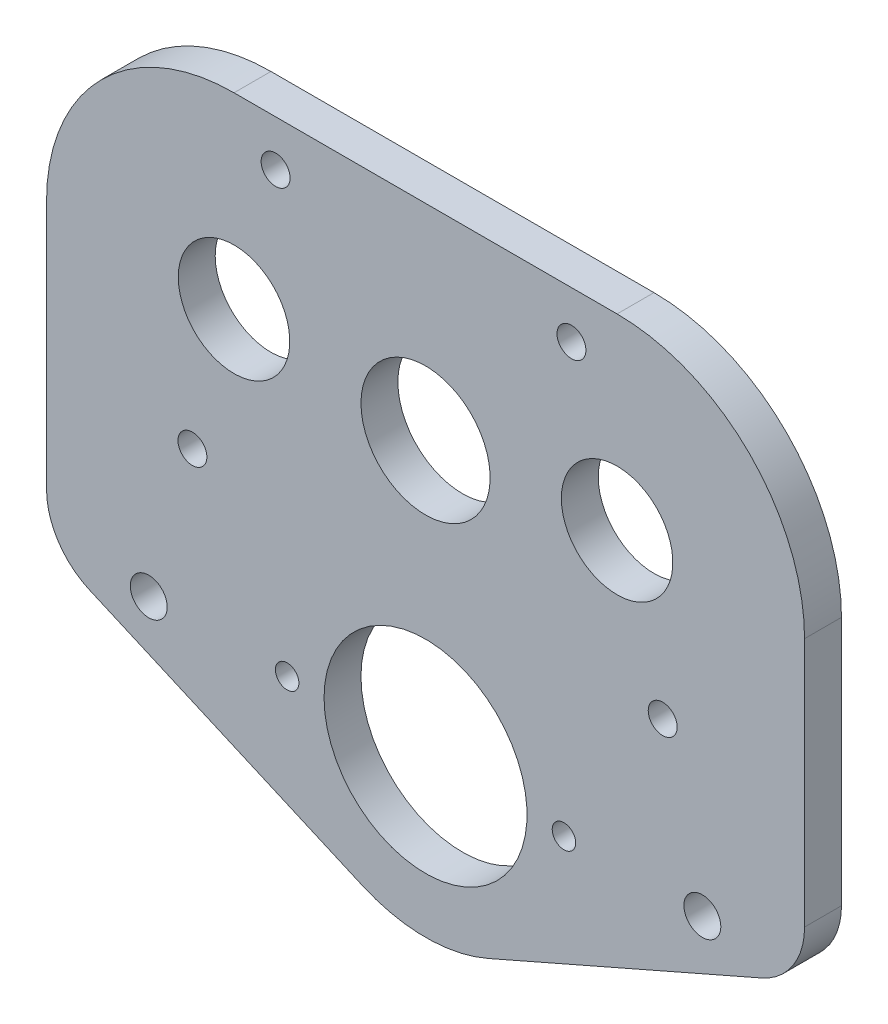
ISO-10303-21;
HEADER;
FILE_DESCRIPTION(('STEP AP214'),'2;1');
FILE_NAME('part.step','',(''),(''),'','','');
FILE_SCHEMA(('AUTOMOTIVE_DESIGN { 1 0 10303 214 1 1 1 1 }'));
ENDSEC;
DATA;
#1=APPLICATION_CONTEXT('core data for automotive mechanical design processes');
#2=APPLICATION_PROTOCOL_DEFINITION('international standard','automotive_design',2000,#1);
#3=PRODUCT_CONTEXT('',#1,'mechanical');
#4=PRODUCT('Part','Part','',(#3));
#5=PRODUCT_RELATED_PRODUCT_CATEGORY('part','',(#4));
#6=PRODUCT_DEFINITION_FORMATION('','',#4);
#7=PRODUCT_DEFINITION_CONTEXT('part definition',#1,'design');
#8=PRODUCT_DEFINITION('design','',#6,#7);
#9=PRODUCT_DEFINITION_SHAPE('','',#8);
#10=(LENGTH_UNIT() NAMED_UNIT(*) SI_UNIT(.MILLI.,.METRE.));
#11=(NAMED_UNIT(*) PLANE_ANGLE_UNIT() SI_UNIT($,.RADIAN.));
#12=(NAMED_UNIT(*) SI_UNIT($,.STERADIAN.) SOLID_ANGLE_UNIT());
#13=UNCERTAINTY_MEASURE_WITH_UNIT(LENGTH_MEASURE(1.E-05),#10,'distance_accuracy_value','');
#14=(GEOMETRIC_REPRESENTATION_CONTEXT(3) GLOBAL_UNCERTAINTY_ASSIGNED_CONTEXT((#13)) GLOBAL_UNIT_ASSIGNED_CONTEXT((#10,
#11,#12)) REPRESENTATION_CONTEXT('',''));
#15=CARTESIAN_POINT('',(0.,0.,0.));
#16=DIRECTION('',(0.,0.,1.));
#17=DIRECTION('',(1.,0.,0.));
#18=AXIS2_PLACEMENT_3D('',#15,#16,#17);
#19=CARTESIAN_POINT('',(-32.953753071217,50.1335462408504,-3.175));
#20=DIRECTION('',(0.,0.,1.));
#21=DIRECTION('',(1.,0.,0.));
#22=AXIS2_PLACEMENT_3D('',#19,#20,#21);
#23=PLANE('',#22);
#24=CARTESIAN_POINT('',(25.1047214140933,74.2903817547473,-3.175));
#25=DIRECTION('',(0.,0.,-1.));
#26=DIRECTION('',(-1.,0.,0.));
#27=AXIS2_PLACEMENT_3D('',#24,#25,#26);
#28=CIRCLE('',#27,2.4892);
#29=CARTESIAN_POINT('',(22.6155214140933,74.2903817547473,-3.175));
#30=VERTEX_POINT('',#29);
#31=EDGE_CURVE('E188',#30,#30,#28,.F.);
#32=ORIENTED_EDGE('',*,*,#31,.T.);
#33=EDGE_LOOP('',(#32));
#34=FACE_BOUND('',#33,.T.);
#35=CARTESIAN_POINT('',(-40.1097600149893,25.7624247110422,-3.175));
#36=DIRECTION('',(0.,0.,-1.));
#37=DIRECTION('',(-1.,0.,0.));
#38=AXIS2_PLACEMENT_3D('',#35,#36,#37);
#39=CIRCLE('',#38,2.4892);
#40=CARTESIAN_POINT('',(-42.5989600149893,25.7624247110422,-3.175));
#41=VERTEX_POINT('',#40);
#42=EDGE_CURVE('E191',#41,#41,#39,.F.);
#43=ORIENTED_EDGE('',*,*,#42,.T.);
#44=EDGE_LOOP('',(#43));
#45=FACE_BOUND('',#44,.T.);
#46=CARTESIAN_POINT('',(-32.953753071217,50.1335462408504,-3.175));
#47=DIRECTION('',(0.,0.,-1.));
#48=DIRECTION('',(-1.,0.,0.));
#49=AXIS2_PLACEMENT_3D('',#46,#47,#48);
#50=CIRCLE('',#49,9.5885);
#51=CARTESIAN_POINT('',(-42.542253071217,50.1335462408504,-3.175));
#52=VERTEX_POINT('',#51);
#53=EDGE_CURVE('E194',#52,#52,#50,.F.);
#54=ORIENTED_EDGE('',*,*,#53,.T.);
#55=EDGE_LOOP('',(#54));
#56=FACE_BOUND('',#55,.T.);
#57=CARTESIAN_POINT('',(0.,47.0662,-3.175));
#58=DIRECTION('',(0.,0.,-1.));
#59=DIRECTION('',(-1.,0.,0.));
#60=AXIS2_PLACEMENT_3D('',#57,#58,#59);
#61=CIRCLE('',#60,11.1125);
#62=CARTESIAN_POINT('',(-11.1125,47.0662,-3.175));
#63=VERTEX_POINT('',#62);
#64=EDGE_CURVE('E197',#63,#63,#61,.F.);
#65=ORIENTED_EDGE('',*,*,#64,.T.);
#66=EDGE_LOOP('',(#65));
#67=FACE_BOUND('',#66,.T.);
#68=CARTESIAN_POINT('',(-47.625,0.,-3.175));
#69=DIRECTION('',(0.,0.,-1.));
#70=DIRECTION('',(-1.,0.,0.));
#71=AXIS2_PLACEMENT_3D('',#68,#69,#70);
#72=CIRCLE('',#71,3.175);
#73=CARTESIAN_POINT('',(-50.8,0.,-3.175));
#74=VERTEX_POINT('',#73);
#75=EDGE_CURVE('E116',#74,#74,#72,.F.);
#76=ORIENTED_EDGE('',*,*,#75,.T.);
#77=EDGE_LOOP('',(#76));
#78=FACE_BOUND('',#77,.T.);
#79=CARTESIAN_POINT('',(47.625,0.,-3.175));
#80=DIRECTION('',(0.,0.,-1.));
#81=DIRECTION('',(-1.,0.,0.));
#82=AXIS2_PLACEMENT_3D('',#79,#80,#81);
#83=CIRCLE('',#82,3.175);
#84=CARTESIAN_POINT('',(44.45,0.,-3.175));
#85=VERTEX_POINT('',#84);
#86=EDGE_CURVE('E113',#85,#85,#83,.F.);
#87=ORIENTED_EDGE('',*,*,#86,.T.);
#88=EDGE_LOOP('',(#87));
#89=FACE_BOUND('',#88,.T.);
#90=DIRECTION('',(1.,0.,0.));
#91=VECTOR('',#90,1.);
#92=CARTESIAN_POINT('',(-32.953753071217,82.3915462408504,-3.175));
#93=LINE('',#92,#91);
#94=CARTESIAN_POINT('',(-32.953753071217,82.3915462408504,-3.175));
#95=VERTEX_POINT('',#94);
#96=CARTESIAN_POINT('',(32.953753071217,82.3915462408504,-3.175));
#97=VERTEX_POINT('',#96);
#98=EDGE_CURVE('E96',#95,#97,#93,.T.);
#99=ORIENTED_EDGE('',*,*,#98,.T.);
#100=CARTESIAN_POINT('',(32.953753071217,50.1335462408504,-3.175));
#101=DIRECTION('',(0.,0.,-1.));
#102=DIRECTION('',(-1.,0.,0.));
#103=AXIS2_PLACEMENT_3D('',#100,#101,#102);
#104=CIRCLE('',#103,32.258);
#105=CARTESIAN_POINT('',(65.211753071217,50.1335462408504,-3.175));
#106=VERTEX_POINT('',#105);
#107=EDGE_CURVE('E124',#106,#97,#104,.F.);
#108=ORIENTED_EDGE('',*,*,#107,.F.);
#109=DIRECTION('',(0.,1.,0.));
#110=VECTOR('',#109,1.);
#111=CARTESIAN_POINT('',(65.211753071217,50.1335462408504,-3.175));
#112=LINE('',#111,#110);
#113=CARTESIAN_POINT('',(65.211753071217,7.15989086379879,-3.175));
#114=VERTEX_POINT('',#113);
#115=EDGE_CURVE('E121',#106,#114,#112,.F.);
#116=ORIENTED_EDGE('',*,*,#115,.T.);
#117=CARTESIAN_POINT('',(52.8998993701809,7.15989086379879,-3.175));
#118=DIRECTION('',(0.,0.,-1.));
#119=DIRECTION('',(-1.,0.,0.));
#120=AXIS2_PLACEMENT_3D('',#117,#118,#119);
#121=CIRCLE('',#120,12.3118537010361);
#122=CARTESIAN_POINT('',(57.8417436831934,-4.11662971400636,-3.175));
#123=VERTEX_POINT('',#122);
#124=EDGE_CURVE('E129',#123,#114,#121,.F.);
#125=ORIENTED_EDGE('',*,*,#124,.F.);
#126=DIRECTION('',(-0.915907616483142,-0.401389135463542,0.));
#127=VECTOR('',#126,1.);
#128=CARTESIAN_POINT('',(57.8417436831934,-4.11662971400636,-3.175));
#129=LINE('',#128,#127);
#130=CARTESIAN_POINT('',(10.8324892933223,-24.7180567998388,-3.175));
#131=VERTEX_POINT('',#130);
#132=EDGE_CURVE('E126',#123,#131,#129,.T.);
#133=ORIENTED_EDGE('',*,*,#132,.T.);
#134=CARTESIAN_POINT('',(0.,0.,-3.175));
#135=DIRECTION('',(0.,0.,-1.));
#136=DIRECTION('',(-1.,0.,0.));
#137=AXIS2_PLACEMENT_3D('',#134,#135,#136);
#138=CIRCLE('',#137,26.9875);
#139=CARTESIAN_POINT('',(-10.8325973233683,-24.7180094562599,-3.175));
#140=VERTEX_POINT('',#139);
#141=EDGE_CURVE('E134',#140,#131,#138,.F.);
#142=ORIENTED_EDGE('',*,*,#141,.F.);
#143=DIRECTION('',(-0.915905862205091,0.401393138429581,0.));
#144=VECTOR('',#143,1.);
#145=CARTESIAN_POINT('',(-57.8417929671256,-4.11636320293274,-3.175));
#146=LINE('',#145,#144);
#147=CARTESIAN_POINT('',(-57.8417929671256,-4.11636320293274,-3.175));
#148=VERTEX_POINT('',#147);
#149=EDGE_CURVE('E131',#140,#148,#146,.T.);
#150=ORIENTED_EDGE('',*,*,#149,.T.);
#151=CARTESIAN_POINT('',(-52.8998993701808,7.1601357764577,-3.175));
#152=DIRECTION('',(0.,0.,-1.));
#153=DIRECTION('',(-1.,0.,0.));
#154=AXIS2_PLACEMENT_3D('',#151,#152,#153);
#155=CIRCLE('',#154,12.3118537010361);
#156=CARTESIAN_POINT('',(-65.211753071217,7.1601357764577,-3.175));
#157=VERTEX_POINT('',#156);
#158=EDGE_CURVE('E136',#157,#148,#155,.F.);
#159=ORIENTED_EDGE('',*,*,#158,.F.);
#160=DIRECTION('',(0.,1.,0.));
#161=VECTOR('',#160,1.);
#162=CARTESIAN_POINT('',(-65.211753071217,50.1335462408504,-3.175));
#163=LINE('',#162,#161);
#164=CARTESIAN_POINT('',(-65.211753071217,50.1335462408504,-3.175));
#165=VERTEX_POINT('',#164);
#166=EDGE_CURVE('E98',#157,#165,#163,.T.);
#167=ORIENTED_EDGE('',*,*,#166,.T.);
#168=CARTESIAN_POINT('',(-32.953753071217,50.1335462408504,-3.175));
#169=DIRECTION('',(0.,0.,-1.));
#170=DIRECTION('',(-1.,0.,0.));
#171=AXIS2_PLACEMENT_3D('',#168,#169,#170);
#172=CIRCLE('',#171,32.258);
#173=EDGE_CURVE('E92',#95,#165,#172,.F.);
#174=ORIENTED_EDGE('',*,*,#173,.F.);
#175=EDGE_LOOP('',(#99,#108,#116,#125,#133,#142,#150,#159,#167,#174));
#176=FACE_BOUND('',#175,.T.);
#177=CARTESIAN_POINT('',(0.,0.,-3.175));
#178=DIRECTION('',(0.,0.,-1.));
#179=DIRECTION('',(-1.,0.,0.));
#180=AXIS2_PLACEMENT_3D('',#177,#178,#179);
#181=CIRCLE('',#180,17.4625);
#182=CARTESIAN_POINT('',(-17.4625,0.,-3.175));
#183=VERTEX_POINT('',#182);
#184=EDGE_CURVE('E102',#183,#183,#181,.F.);
#185=ORIENTED_EDGE('',*,*,#184,.T.);
#186=EDGE_LOOP('',(#185));
#187=FACE_BOUND('',#186,.T.);
#188=CARTESIAN_POINT('',(-23.8125,0.,-3.175));
#189=DIRECTION('',(0.,0.,-1.));
#190=DIRECTION('',(-1.,0.,0.));
#191=AXIS2_PLACEMENT_3D('',#188,#189,#190);
#192=CIRCLE('',#191,2.0193);
#193=CARTESIAN_POINT('',(-25.8318,0.,-3.175));
#194=VERTEX_POINT('',#193);
#195=EDGE_CURVE('E212',#194,#194,#192,.F.);
#196=ORIENTED_EDGE('',*,*,#195,.T.);
#197=EDGE_LOOP('',(#196));
#198=FACE_BOUND('',#197,.T.);
#199=CARTESIAN_POINT('',(23.8125,0.,-3.175));
#200=DIRECTION('',(0.,0.,-1.));
#201=DIRECTION('',(-1.,0.,0.));
#202=AXIS2_PLACEMENT_3D('',#199,#200,#201);
#203=CIRCLE('',#202,2.0193);
#204=CARTESIAN_POINT('',(21.7932,0.,-3.175));
#205=VERTEX_POINT('',#204);
#206=EDGE_CURVE('E215',#205,#205,#203,.F.);
#207=ORIENTED_EDGE('',*,*,#206,.T.);
#208=EDGE_LOOP('',(#207));
#209=FACE_BOUND('',#208,.T.);
#210=CARTESIAN_POINT('',(32.953753071217,50.1335462408504,-3.175));
#211=DIRECTION('',(0.,0.,-1.));
#212=DIRECTION('',(-1.,0.,0.));
#213=AXIS2_PLACEMENT_3D('',#210,#211,#212);
#214=CIRCLE('',#213,9.58850000000001);
#215=CARTESIAN_POINT('',(23.365253071217,50.1335462408504,-3.175));
#216=VERTEX_POINT('',#215);
#217=EDGE_CURVE('E218',#216,#216,#214,.F.);
#218=ORIENTED_EDGE('',*,*,#217,.T.);
#219=EDGE_LOOP('',(#218));
#220=FACE_BOUND('',#219,.T.);
#221=CARTESIAN_POINT('',(-25.7977461274447,74.5046677706586,-3.175));
#222=DIRECTION('',(0.,0.,-1.));
#223=DIRECTION('',(-1.,0.,0.));
#224=AXIS2_PLACEMENT_3D('',#221,#222,#223);
#225=CIRCLE('',#224,2.48919999999999);
#226=CARTESIAN_POINT('',(-28.2869461274446,74.5046677706586,-3.175));
#227=VERTEX_POINT('',#226);
#228=EDGE_CURVE('E220',#227,#227,#225,.F.);
#229=ORIENTED_EDGE('',*,*,#228,.T.);
#230=EDGE_LOOP('',(#229));
#231=FACE_BOUND('',#230,.T.);
#232=CARTESIAN_POINT('',(40.8027847283406,25.9767107269535,-3.175));
#233=DIRECTION('',(0.,0.,-1.));
#234=DIRECTION('',(-1.,0.,0.));
#235=AXIS2_PLACEMENT_3D('',#232,#233,#234);
#236=CIRCLE('',#235,2.48919999999999);
#237=CARTESIAN_POINT('',(38.3135847283406,25.9767107269535,-3.175));
#238=VERTEX_POINT('',#237);
#239=EDGE_CURVE('E20',#238,#238,#236,.F.);
#240=ORIENTED_EDGE('',*,*,#239,.T.);
#241=EDGE_LOOP('',(#240));
#242=FACE_BOUND('',#241,.T.);
#243=ADVANCED_FACE('F17',(#34,#45,#56,#67,#78,#89,#176,#187,#198,#209,#220,#231,#242),#23,.F.);
#244=CARTESIAN_POINT('',(40.8027847283406,25.9767107269535,3.175));
#245=DIRECTION('',(0.,0.,-1.));
#246=DIRECTION('',(-1.,0.,0.));
#247=AXIS2_PLACEMENT_3D('',#244,#245,#246);
#248=CYLINDRICAL_SURFACE('',#247,2.48919999999999);
#249=CARTESIAN_POINT('',(40.8027847283406,25.9767107269535,3.175));
#250=DIRECTION('',(0.,0.,-1.));
#251=DIRECTION('',(-1.,0.,0.));
#252=AXIS2_PLACEMENT_3D('',#249,#250,#251);
#253=CIRCLE('',#252,2.48919999999999);
#254=CARTESIAN_POINT('',(38.3135847283406,25.9767107269535,3.175));
#255=VERTEX_POINT('',#254);
#256=EDGE_CURVE('E185',#255,#255,#253,.T.);
#257=ORIENTED_EDGE('',*,*,#256,.F.);
#258=EDGE_LOOP('',(#257));
#259=FACE_BOUND('',#258,.T.);
#260=ORIENTED_EDGE('',*,*,#239,.F.);
#261=EDGE_LOOP('',(#260));
#262=FACE_BOUND('',#261,.T.);
#263=ADVANCED_FACE('F228',(#259,#262),#248,.F.);
#264=CARTESIAN_POINT('',(-25.7977461274447,74.5046677706586,3.175));
#265=DIRECTION('',(0.,0.,-1.));
#266=DIRECTION('',(-1.,0.,0.));
#267=AXIS2_PLACEMENT_3D('',#264,#265,#266);
#268=CYLINDRICAL_SURFACE('',#267,2.48919999999999);
#269=CARTESIAN_POINT('',(-25.7977461274447,74.5046677706586,3.175));
#270=DIRECTION('',(0.,0.,-1.));
#271=DIRECTION('',(-1.,0.,0.));
#272=AXIS2_PLACEMENT_3D('',#269,#270,#271);
#273=CIRCLE('',#272,2.48919999999999);
#274=CARTESIAN_POINT('',(-28.2869461274446,74.5046677706586,3.175));
#275=VERTEX_POINT('',#274);
#276=EDGE_CURVE('E182',#275,#275,#273,.T.);
#277=ORIENTED_EDGE('',*,*,#276,.F.);
#278=EDGE_LOOP('',(#277));
#279=FACE_BOUND('',#278,.T.);
#280=ORIENTED_EDGE('',*,*,#228,.F.);
#281=EDGE_LOOP('',(#280));
#282=FACE_BOUND('',#281,.T.);
#283=ADVANCED_FACE('F230',(#279,#282),#268,.F.);
#284=CARTESIAN_POINT('',(32.953753071217,50.1335462408504,3.175));
#285=DIRECTION('',(0.,0.,-1.));
#286=DIRECTION('',(-1.,0.,0.));
#287=AXIS2_PLACEMENT_3D('',#284,#285,#286);
#288=CYLINDRICAL_SURFACE('',#287,9.58850000000001);
#289=CARTESIAN_POINT('',(32.953753071217,50.1335462408504,3.175));
#290=DIRECTION('',(0.,0.,-1.));
#291=DIRECTION('',(-1.,0.,0.));
#292=AXIS2_PLACEMENT_3D('',#289,#290,#291);
#293=CIRCLE('',#292,9.58850000000001);
#294=CARTESIAN_POINT('',(23.365253071217,50.1335462408504,3.175));
#295=VERTEX_POINT('',#294);
#296=EDGE_CURVE('E179',#295,#295,#293,.T.);
#297=ORIENTED_EDGE('',*,*,#296,.F.);
#298=EDGE_LOOP('',(#297));
#299=FACE_BOUND('',#298,.T.);
#300=ORIENTED_EDGE('',*,*,#217,.F.);
#301=EDGE_LOOP('',(#300));
#302=FACE_BOUND('',#301,.T.);
#303=ADVANCED_FACE('F237',(#299,#302),#288,.F.);
#304=CARTESIAN_POINT('',(23.8125,0.,3.175));
#305=DIRECTION('',(0.,0.,-1.));
#306=DIRECTION('',(-1.,0.,0.));
#307=AXIS2_PLACEMENT_3D('',#304,#305,#306);
#308=CYLINDRICAL_SURFACE('',#307,2.0193);
#309=CARTESIAN_POINT('',(23.8125,0.,3.175));
#310=DIRECTION('',(0.,0.,-1.));
#311=DIRECTION('',(-1.,0.,0.));
#312=AXIS2_PLACEMENT_3D('',#309,#310,#311);
#313=CIRCLE('',#312,2.0193);
#314=CARTESIAN_POINT('',(21.7932,0.,3.175));
#315=VERTEX_POINT('',#314);
#316=EDGE_CURVE('E176',#315,#315,#313,.T.);
#317=ORIENTED_EDGE('',*,*,#316,.F.);
#318=EDGE_LOOP('',(#317));
#319=FACE_BOUND('',#318,.T.);
#320=ORIENTED_EDGE('',*,*,#206,.F.);
#321=EDGE_LOOP('',(#320));
#322=FACE_BOUND('',#321,.T.);
#323=ADVANCED_FACE('F316',(#319,#322),#308,.F.);
#324=CARTESIAN_POINT('',(-23.8125,0.,3.175));
#325=DIRECTION('',(0.,0.,-1.));
#326=DIRECTION('',(-1.,0.,0.));
#327=AXIS2_PLACEMENT_3D('',#324,#325,#326);
#328=CYLINDRICAL_SURFACE('',#327,2.0193);
#329=CARTESIAN_POINT('',(-23.8125,0.,3.175));
#330=DIRECTION('',(0.,0.,-1.));
#331=DIRECTION('',(-1.,0.,0.));
#332=AXIS2_PLACEMENT_3D('',#329,#330,#331);
#333=CIRCLE('',#332,2.0193);
#334=CARTESIAN_POINT('',(-25.8318,0.,3.175));
#335=VERTEX_POINT('',#334);
#336=EDGE_CURVE('E173',#335,#335,#333,.T.);
#337=ORIENTED_EDGE('',*,*,#336,.F.);
#338=EDGE_LOOP('',(#337));
#339=FACE_BOUND('',#338,.T.);
#340=ORIENTED_EDGE('',*,*,#195,.F.);
#341=EDGE_LOOP('',(#340));
#342=FACE_BOUND('',#341,.T.);
#343=ADVANCED_FACE('F312',(#339,#342),#328,.F.);
#344=CARTESIAN_POINT('',(0.,0.,3.175));
#345=DIRECTION('',(0.,0.,-1.));
#346=DIRECTION('',(-1.,0.,0.));
#347=AXIS2_PLACEMENT_3D('',#344,#345,#346);
#348=CYLINDRICAL_SURFACE('',#347,17.4625);
#349=CARTESIAN_POINT('',(0.,0.,3.175));
#350=DIRECTION('',(0.,0.,-1.));
#351=DIRECTION('',(-1.,0.,0.));
#352=AXIS2_PLACEMENT_3D('',#349,#350,#351);
#353=CIRCLE('',#352,17.4625);
#354=CARTESIAN_POINT('',(-17.4625,0.,3.175));
#355=VERTEX_POINT('',#354);
#356=EDGE_CURVE('E170',#355,#355,#353,.T.);
#357=ORIENTED_EDGE('',*,*,#356,.F.);
#358=EDGE_LOOP('',(#357));
#359=FACE_BOUND('',#358,.T.);
#360=ORIENTED_EDGE('',*,*,#184,.F.);
#361=EDGE_LOOP('',(#360));
#362=FACE_BOUND('',#361,.T.);
#363=ADVANCED_FACE('F309',(#359,#362),#348,.F.);
#364=CARTESIAN_POINT('',(-32.953753071217,50.1335462408504,3.175));
#365=DIRECTION('',(0.,0.,-1.));
#366=DIRECTION('',(-1.,0.,0.));
#367=AXIS2_PLACEMENT_3D('',#364,#365,#366);
#368=CYLINDRICAL_SURFACE('',#367,32.258);
#369=CARTESIAN_POINT('',(-32.953753071217,50.1335462408504,3.175));
#370=DIRECTION('',(0.,0.,-1.));
#371=DIRECTION('',(-1.,0.,0.));
#372=AXIS2_PLACEMENT_3D('',#369,#370,#371);
#373=CIRCLE('',#372,32.258);
#374=CARTESIAN_POINT('',(-32.953753071217,82.3915462408504,3.175));
#375=VERTEX_POINT('',#374);
#376=CARTESIAN_POINT('',(-65.211753071217,50.1335462408504,3.175));
#377=VERTEX_POINT('',#376);
#378=EDGE_CURVE('E108',#375,#377,#373,.F.);
#379=ORIENTED_EDGE('',*,*,#378,.F.);
#380=DIRECTION('',(0.,0.,-1.));
#381=VECTOR('',#380,1.);
#382=CARTESIAN_POINT('',(-32.953753071217,82.3915462408504,3.175));
#383=LINE('',#382,#381);
#384=EDGE_CURVE('E105',#375,#95,#383,.T.);
#385=ORIENTED_EDGE('',*,*,#384,.T.);
#386=ORIENTED_EDGE('',*,*,#173,.T.);
#387=DIRECTION('',(0.,0.,-1.));
#388=VECTOR('',#387,1.);
#389=CARTESIAN_POINT('',(-65.211753071217,50.1335462408504,3.175));
#390=LINE('',#389,#388);
#391=EDGE_CURVE('E101',#165,#377,#390,.F.);
#392=ORIENTED_EDGE('',*,*,#391,.T.);
#393=EDGE_LOOP('',(#379,#385,#386,#392));
#394=FACE_BOUND('',#393,.T.);
#395=ADVANCED_FACE('F106',(#394),#368,.T.);
#396=CARTESIAN_POINT('',(-65.211753071217,50.1335462408504,3.175));
#397=DIRECTION('',(1.,0.,0.));
#398=DIRECTION('',(0.,0.,-1.));
#399=AXIS2_PLACEMENT_3D('',#396,#397,#398);
#400=PLANE('',#399);
#401=DIRECTION('',(0.,0.,-1.));
#402=VECTOR('',#401,1.);
#403=CARTESIAN_POINT('',(-65.211753071217,7.1601357764577,3.175));
#404=LINE('',#403,#402);
#405=CARTESIAN_POINT('',(-65.211753071217,7.1601357764577,3.175));
#406=VERTEX_POINT('',#405);
#407=EDGE_CURVE('E208',#406,#157,#404,.T.);
#408=ORIENTED_EDGE('',*,*,#407,.F.);
#409=DIRECTION('',(0.,1.,0.));
#410=VECTOR('',#409,1.);
#411=CARTESIAN_POINT('',(-65.211753071217,50.1335462408504,3.175));
#412=LINE('',#411,#410);
#413=EDGE_CURVE('E168',#377,#406,#412,.F.);
#414=ORIENTED_EDGE('',*,*,#413,.F.);
#415=ORIENTED_EDGE('',*,*,#391,.F.);
#416=ORIENTED_EDGE('',*,*,#166,.F.);
#417=EDGE_LOOP('',(#408,#414,#415,#416));
#418=FACE_BOUND('',#417,.T.);
#419=ADVANCED_FACE('F302',(#418),#400,.F.);
#420=CARTESIAN_POINT('',(-52.8998993701808,7.1601357764577,3.175));
#421=DIRECTION('',(0.,0.,-1.));
#422=DIRECTION('',(-1.,0.,0.));
#423=AXIS2_PLACEMENT_3D('',#420,#421,#422);
#424=CYLINDRICAL_SURFACE('',#423,12.3118537010361);
#425=CARTESIAN_POINT('',(-52.8998993701808,7.1601357764577,3.175));
#426=DIRECTION('',(0.,0.,-1.));
#427=DIRECTION('',(-1.,0.,0.));
#428=AXIS2_PLACEMENT_3D('',#425,#426,#427);
#429=CIRCLE('',#428,12.3118537010361);
#430=CARTESIAN_POINT('',(-57.8417929671256,-4.11636320293273,3.175));
#431=VERTEX_POINT('',#430);
#432=EDGE_CURVE('E165',#406,#431,#429,.F.);
#433=ORIENTED_EDGE('',*,*,#432,.F.);
#434=ORIENTED_EDGE('',*,*,#407,.T.);
#435=ORIENTED_EDGE('',*,*,#158,.T.);
#436=DIRECTION('',(0.,0.,1.));
#437=VECTOR('',#436,1.);
#438=CARTESIAN_POINT('',(-57.8417929671256,-4.11636320293274,3.175));
#439=LINE('',#438,#437);
#440=EDGE_CURVE('E135',#148,#431,#439,.T.);
#441=ORIENTED_EDGE('',*,*,#440,.T.);
#442=EDGE_LOOP('',(#433,#434,#435,#441));
#443=FACE_BOUND('',#442,.T.);
#444=ADVANCED_FACE('F298',(#443),#424,.T.);
#445=CARTESIAN_POINT('',(-57.8417929671256,-4.11636320293274,3.175));
#446=DIRECTION('',(0.401393138429581,0.915905862205091,0.));
#447=DIRECTION('',(-0.915905862205091,0.401393138429581,0.));
#448=AXIS2_PLACEMENT_3D('',#445,#446,#447);
#449=PLANE('',#448);
#450=DIRECTION('',(0.,0.,-1.));
#451=VECTOR('',#450,1.);
#452=CARTESIAN_POINT('',(-10.8325973233683,-24.7180094562599,3.175));
#453=LINE('',#452,#451);
#454=CARTESIAN_POINT('',(-10.8325973233683,-24.7180094562599,3.175));
#455=VERTEX_POINT('',#454);
#456=EDGE_CURVE('E207',#455,#140,#453,.T.);
#457=ORIENTED_EDGE('',*,*,#456,.F.);
#458=DIRECTION('',(0.915905862205091,-0.401393138429581,0.));
#459=VECTOR('',#458,1.);
#460=CARTESIAN_POINT('',(-57.8417929671256,-4.11636320293274,3.175));
#461=LINE('',#460,#459);
#462=EDGE_CURVE('E164',#431,#455,#461,.T.);
#463=ORIENTED_EDGE('',*,*,#462,.F.);
#464=ORIENTED_EDGE('',*,*,#440,.F.);
#465=ORIENTED_EDGE('',*,*,#149,.F.);
#466=EDGE_LOOP('',(#457,#463,#464,#465));
#467=FACE_BOUND('',#466,.T.);
#468=ADVANCED_FACE('F294',(#467),#449,.F.);
#469=CARTESIAN_POINT('',(0.,0.,3.175));
#470=DIRECTION('',(0.,0.,-1.));
#471=DIRECTION('',(-1.,0.,0.));
#472=AXIS2_PLACEMENT_3D('',#469,#470,#471);
#473=CYLINDRICAL_SURFACE('',#472,26.9875);
#474=CARTESIAN_POINT('',(0.,0.,3.175));
#475=DIRECTION('',(0.,0.,-1.));
#476=DIRECTION('',(-1.,0.,0.));
#477=AXIS2_PLACEMENT_3D('',#474,#475,#476);
#478=CIRCLE('',#477,26.9875);
#479=CARTESIAN_POINT('',(10.8324892933223,-24.7180567998388,3.175));
#480=VERTEX_POINT('',#479);
#481=EDGE_CURVE('E161',#455,#480,#478,.F.);
#482=ORIENTED_EDGE('',*,*,#481,.F.);
#483=ORIENTED_EDGE('',*,*,#456,.T.);
#484=ORIENTED_EDGE('',*,*,#141,.T.);
#485=DIRECTION('',(0.,0.,1.));
#486=VECTOR('',#485,1.);
#487=CARTESIAN_POINT('',(10.8324892933223,-24.7180567998388,3.175));
#488=LINE('',#487,#486);
#489=EDGE_CURVE('E130',#131,#480,#488,.T.);
#490=ORIENTED_EDGE('',*,*,#489,.T.);
#491=EDGE_LOOP('',(#482,#483,#484,#490));
#492=FACE_BOUND('',#491,.T.);
#493=ADVANCED_FACE('F290',(#492),#473,.T.);
#494=CARTESIAN_POINT('',(57.8417436831934,-4.11662971400636,3.175));
#495=DIRECTION('',(-0.401389135463542,0.915907616483142,0.));
#496=DIRECTION('',(-0.915907616483142,-0.401389135463542,0.));
#497=AXIS2_PLACEMENT_3D('',#494,#495,#496);
#498=PLANE('',#497);
#499=DIRECTION('',(0.,0.,-1.));
#500=VECTOR('',#499,1.);
#501=CARTESIAN_POINT('',(57.8417436831934,-4.11662971400635,3.175));
#502=LINE('',#501,#500);
#503=CARTESIAN_POINT('',(57.8417436831934,-4.11662971400636,3.175));
#504=VERTEX_POINT('',#503);
#505=EDGE_CURVE('E205',#504,#123,#502,.T.);
#506=ORIENTED_EDGE('',*,*,#505,.F.);
#507=DIRECTION('',(0.915907616483142,0.401389135463541,0.));
#508=VECTOR('',#507,1.);
#509=CARTESIAN_POINT('',(10.8324892933223,-24.7180567998388,3.175));
#510=LINE('',#509,#508);
#511=EDGE_CURVE('E160',#480,#504,#510,.T.);
#512=ORIENTED_EDGE('',*,*,#511,.F.);
#513=ORIENTED_EDGE('',*,*,#489,.F.);
#514=ORIENTED_EDGE('',*,*,#132,.F.);
#515=EDGE_LOOP('',(#506,#512,#513,#514));
#516=FACE_BOUND('',#515,.T.);
#517=ADVANCED_FACE('F286',(#516),#498,.F.);
#518=CARTESIAN_POINT('',(52.8998993701809,7.15989086379879,3.175));
#519=DIRECTION('',(0.,0.,-1.));
#520=DIRECTION('',(-1.,0.,0.));
#521=AXIS2_PLACEMENT_3D('',#518,#519,#520);
#522=CYLINDRICAL_SURFACE('',#521,12.3118537010361);
#523=CARTESIAN_POINT('',(52.8998993701809,7.15989086379879,3.175));
#524=DIRECTION('',(0.,0.,-1.));
#525=DIRECTION('',(-1.,0.,0.));
#526=AXIS2_PLACEMENT_3D('',#523,#524,#525);
#527=CIRCLE('',#526,12.3118537010361);
#528=CARTESIAN_POINT('',(65.211753071217,7.15989086379879,3.175));
#529=VERTEX_POINT('',#528);
#530=EDGE_CURVE('E157',#504,#529,#527,.F.);
#531=ORIENTED_EDGE('',*,*,#530,.F.);
#532=ORIENTED_EDGE('',*,*,#505,.T.);
#533=ORIENTED_EDGE('',*,*,#124,.T.);
#534=DIRECTION('',(0.,0.,1.));
#535=VECTOR('',#534,1.);
#536=CARTESIAN_POINT('',(65.211753071217,7.15989086379879,3.175));
#537=LINE('',#536,#535);
#538=EDGE_CURVE('E125',#114,#529,#537,.T.);
#539=ORIENTED_EDGE('',*,*,#538,.T.);
#540=EDGE_LOOP('',(#531,#532,#533,#539));
#541=FACE_BOUND('',#540,.T.);
#542=ADVANCED_FACE('F282',(#541),#522,.T.);
#543=CARTESIAN_POINT('',(65.211753071217,50.1335462408504,3.175));
#544=DIRECTION('',(-1.,0.,0.));
#545=DIRECTION('',(0.,0.,1.));
#546=AXIS2_PLACEMENT_3D('',#543,#544,#545);
#547=PLANE('',#546);
#548=DIRECTION('',(0.,0.,-1.));
#549=VECTOR('',#548,1.);
#550=CARTESIAN_POINT('',(65.211753071217,50.1335462408504,3.175));
#551=LINE('',#550,#549);
#552=CARTESIAN_POINT('',(65.211753071217,50.1335462408504,3.175));
#553=VERTEX_POINT('',#552);
#554=EDGE_CURVE('E203',#553,#106,#551,.T.);
#555=ORIENTED_EDGE('',*,*,#554,.F.);
#556=DIRECTION('',(0.,1.,0.));
#557=VECTOR('',#556,1.);
#558=CARTESIAN_POINT('',(65.211753071217,50.1335462408504,3.175));
#559=LINE('',#558,#557);
#560=EDGE_CURVE('E156',#529,#553,#559,.T.);
#561=ORIENTED_EDGE('',*,*,#560,.F.);
#562=ORIENTED_EDGE('',*,*,#538,.F.);
#563=ORIENTED_EDGE('',*,*,#115,.F.);
#564=EDGE_LOOP('',(#555,#561,#562,#563));
#565=FACE_BOUND('',#564,.T.);
#566=ADVANCED_FACE('F279',(#565),#547,.F.);
#567=CARTESIAN_POINT('',(32.953753071217,50.1335462408504,3.175));
#568=DIRECTION('',(0.,0.,-1.));
#569=DIRECTION('',(-1.,0.,0.));
#570=AXIS2_PLACEMENT_3D('',#567,#568,#569);
#571=CYLINDRICAL_SURFACE('',#570,32.258);
#572=CARTESIAN_POINT('',(32.953753071217,50.1335462408504,3.175));
#573=DIRECTION('',(0.,0.,-1.));
#574=DIRECTION('',(-1.,0.,0.));
#575=AXIS2_PLACEMENT_3D('',#572,#573,#574);
#576=CIRCLE('',#575,32.258);
#577=CARTESIAN_POINT('',(32.953753071217,82.3915462408504,3.175));
#578=VERTEX_POINT('',#577);
#579=EDGE_CURVE('E153',#553,#578,#576,.F.);
#580=ORIENTED_EDGE('',*,*,#579,.F.);
#581=ORIENTED_EDGE('',*,*,#554,.T.);
#582=ORIENTED_EDGE('',*,*,#107,.T.);
#583=DIRECTION('',(0.,0.,-1.));
#584=VECTOR('',#583,1.);
#585=CARTESIAN_POINT('',(32.953753071217,82.3915462408504,3.175));
#586=LINE('',#585,#584);
#587=EDGE_CURVE('E35',#97,#578,#586,.F.);
#588=ORIENTED_EDGE('',*,*,#587,.T.);
#589=EDGE_LOOP('',(#580,#581,#582,#588));
#590=FACE_BOUND('',#589,.T.);
#591=ADVANCED_FACE('F276',(#590),#571,.T.);
#592=CARTESIAN_POINT('',(-32.953753071217,82.3915462408504,3.175));
#593=DIRECTION('',(0.,-1.,0.));
#594=DIRECTION('',(0.,0.,-1.));
#595=AXIS2_PLACEMENT_3D('',#592,#593,#594);
#596=PLANE('',#595);
#597=ORIENTED_EDGE('',*,*,#384,.F.);
#598=DIRECTION('',(1.,0.,0.));
#599=VECTOR('',#598,1.);
#600=CARTESIAN_POINT('',(-32.953753071217,82.3915462408504,3.175));
#601=LINE('',#600,#599);
#602=EDGE_CURVE('E152',#578,#375,#601,.F.);
#603=ORIENTED_EDGE('',*,*,#602,.F.);
#604=ORIENTED_EDGE('',*,*,#587,.F.);
#605=ORIENTED_EDGE('',*,*,#98,.F.);
#606=EDGE_LOOP('',(#597,#603,#604,#605));
#607=FACE_BOUND('',#606,.T.);
#608=ADVANCED_FACE('F112',(#607),#596,.F.);
#609=CARTESIAN_POINT('',(47.625,0.,3.175));
#610=DIRECTION('',(0.,0.,-1.));
#611=DIRECTION('',(-1.,0.,0.));
#612=AXIS2_PLACEMENT_3D('',#609,#610,#611);
#613=CYLINDRICAL_SURFACE('',#612,3.175);
#614=CARTESIAN_POINT('',(47.625,0.,3.175));
#615=DIRECTION('',(0.,0.,-1.));
#616=DIRECTION('',(-1.,0.,0.));
#617=AXIS2_PLACEMENT_3D('',#614,#615,#616);
#618=CIRCLE('',#617,3.175);
#619=CARTESIAN_POINT('',(44.45,0.,3.175));
#620=VERTEX_POINT('',#619);
#621=EDGE_CURVE('E149',#620,#620,#618,.T.);
#622=ORIENTED_EDGE('',*,*,#621,.F.);
#623=EDGE_LOOP('',(#622));
#624=FACE_BOUND('',#623,.T.);
#625=ORIENTED_EDGE('',*,*,#86,.F.);
#626=EDGE_LOOP('',(#625));
#627=FACE_BOUND('',#626,.T.);
#628=ADVANCED_FACE('F269',(#624,#627),#613,.F.);
#629=CARTESIAN_POINT('',(-47.625,0.,3.175));
#630=DIRECTION('',(0.,0.,-1.));
#631=DIRECTION('',(-1.,0.,0.));
#632=AXIS2_PLACEMENT_3D('',#629,#630,#631);
#633=CYLINDRICAL_SURFACE('',#632,3.175);
#634=CARTESIAN_POINT('',(-47.625,0.,3.175));
#635=DIRECTION('',(0.,0.,-1.));
#636=DIRECTION('',(-1.,0.,0.));
#637=AXIS2_PLACEMENT_3D('',#634,#635,#636);
#638=CIRCLE('',#637,3.175);
#639=CARTESIAN_POINT('',(-50.8,0.,3.175));
#640=VERTEX_POINT('',#639);
#641=EDGE_CURVE('E146',#640,#640,#638,.T.);
#642=ORIENTED_EDGE('',*,*,#641,.F.);
#643=EDGE_LOOP('',(#642));
#644=FACE_BOUND('',#643,.T.);
#645=ORIENTED_EDGE('',*,*,#75,.F.);
#646=EDGE_LOOP('',(#645));
#647=FACE_BOUND('',#646,.T.);
#648=ADVANCED_FACE('F265',(#644,#647),#633,.F.);
#649=CARTESIAN_POINT('',(0.,47.0662,3.175));
#650=DIRECTION('',(0.,0.,-1.));
#651=DIRECTION('',(-1.,0.,0.));
#652=AXIS2_PLACEMENT_3D('',#649,#650,#651);
#653=CYLINDRICAL_SURFACE('',#652,11.1125);
#654=CARTESIAN_POINT('',(0.,47.0662,3.175));
#655=DIRECTION('',(0.,0.,-1.));
#656=DIRECTION('',(-1.,0.,0.));
#657=AXIS2_PLACEMENT_3D('',#654,#655,#656);
#658=CIRCLE('',#657,11.1125);
#659=CARTESIAN_POINT('',(-11.1125,47.0662,3.175));
#660=VERTEX_POINT('',#659);
#661=EDGE_CURVE('E143',#660,#660,#658,.T.);
#662=ORIENTED_EDGE('',*,*,#661,.F.);
#663=EDGE_LOOP('',(#662));
#664=FACE_BOUND('',#663,.T.);
#665=ORIENTED_EDGE('',*,*,#64,.F.);
#666=EDGE_LOOP('',(#665));
#667=FACE_BOUND('',#666,.T.);
#668=ADVANCED_FACE('F261',(#664,#667),#653,.F.);
#669=CARTESIAN_POINT('',(-32.953753071217,50.1335462408504,3.175));
#670=DIRECTION('',(0.,0.,-1.));
#671=DIRECTION('',(-1.,0.,0.));
#672=AXIS2_PLACEMENT_3D('',#669,#670,#671);
#673=CYLINDRICAL_SURFACE('',#672,9.5885);
#674=CARTESIAN_POINT('',(-32.953753071217,50.1335462408504,3.175));
#675=DIRECTION('',(0.,0.,-1.));
#676=DIRECTION('',(-1.,0.,0.));
#677=AXIS2_PLACEMENT_3D('',#674,#675,#676);
#678=CIRCLE('',#677,9.5885);
#679=CARTESIAN_POINT('',(-42.542253071217,50.1335462408504,3.175));
#680=VERTEX_POINT('',#679);
#681=EDGE_CURVE('E140',#680,#680,#678,.T.);
#682=ORIENTED_EDGE('',*,*,#681,.F.);
#683=EDGE_LOOP('',(#682));
#684=FACE_BOUND('',#683,.T.);
#685=ORIENTED_EDGE('',*,*,#53,.F.);
#686=EDGE_LOOP('',(#685));
#687=FACE_BOUND('',#686,.T.);
#688=ADVANCED_FACE('F257',(#684,#687),#673,.F.);
#689=CARTESIAN_POINT('',(-40.1097600149893,25.7624247110422,3.175));
#690=DIRECTION('',(0.,0.,-1.));
#691=DIRECTION('',(-1.,0.,0.));
#692=AXIS2_PLACEMENT_3D('',#689,#690,#691);
#693=CYLINDRICAL_SURFACE('',#692,2.4892);
#694=CARTESIAN_POINT('',(-40.1097600149893,25.7624247110422,3.175));
#695=DIRECTION('',(0.,0.,-1.));
#696=DIRECTION('',(-1.,0.,0.));
#697=AXIS2_PLACEMENT_3D('',#694,#695,#696);
#698=CIRCLE('',#697,2.4892);
#699=CARTESIAN_POINT('',(-42.5989600149893,25.7624247110422,3.175));
#700=VERTEX_POINT('',#699);
#701=EDGE_CURVE('E26',#700,#700,#698,.T.);
#702=ORIENTED_EDGE('',*,*,#701,.F.);
#703=EDGE_LOOP('',(#702));
#704=FACE_BOUND('',#703,.T.);
#705=ORIENTED_EDGE('',*,*,#42,.F.);
#706=EDGE_LOOP('',(#705));
#707=FACE_BOUND('',#706,.T.);
#708=ADVANCED_FACE('F250',(#704,#707),#693,.F.);
#709=CARTESIAN_POINT('',(25.1047214140933,74.2903817547473,3.175));
#710=DIRECTION('',(0.,0.,-1.));
#711=DIRECTION('',(-1.,0.,0.));
#712=AXIS2_PLACEMENT_3D('',#709,#710,#711);
#713=CYLINDRICAL_SURFACE('',#712,2.4892);
#714=CARTESIAN_POINT('',(25.1047214140933,74.2903817547473,3.175));
#715=DIRECTION('',(0.,0.,-1.));
#716=DIRECTION('',(-1.,0.,0.));
#717=AXIS2_PLACEMENT_3D('',#714,#715,#716);
#718=CIRCLE('',#717,2.4892);
#719=CARTESIAN_POINT('',(22.6155214140933,74.2903817547473,3.175));
#720=VERTEX_POINT('',#719);
#721=EDGE_CURVE('E11',#720,#720,#718,.T.);
#722=ORIENTED_EDGE('',*,*,#721,.F.);
#723=EDGE_LOOP('',(#722));
#724=FACE_BOUND('',#723,.T.);
#725=ORIENTED_EDGE('',*,*,#31,.F.);
#726=EDGE_LOOP('',(#725));
#727=FACE_BOUND('',#726,.T.);
#728=ADVANCED_FACE('F244',(#724,#727),#713,.F.);
#729=CARTESIAN_POINT('',(-32.953753071217,50.1335462408504,3.175));
#730=DIRECTION('',(0.,0.,1.));
#731=DIRECTION('',(1.,0.,0.));
#732=AXIS2_PLACEMENT_3D('',#729,#730,#731);
#733=PLANE('',#732);
#734=ORIENTED_EDGE('',*,*,#721,.T.);
#735=EDGE_LOOP('',(#734));
#736=FACE_BOUND('',#735,.T.);
#737=ORIENTED_EDGE('',*,*,#701,.T.);
#738=EDGE_LOOP('',(#737));
#739=FACE_BOUND('',#738,.T.);
#740=ORIENTED_EDGE('',*,*,#681,.T.);
#741=EDGE_LOOP('',(#740));
#742=FACE_BOUND('',#741,.T.);
#743=ORIENTED_EDGE('',*,*,#661,.T.);
#744=EDGE_LOOP('',(#743));
#745=FACE_BOUND('',#744,.T.);
#746=ORIENTED_EDGE('',*,*,#641,.T.);
#747=EDGE_LOOP('',(#746));
#748=FACE_BOUND('',#747,.T.);
#749=ORIENTED_EDGE('',*,*,#621,.T.);
#750=EDGE_LOOP('',(#749));
#751=FACE_BOUND('',#750,.T.);
#752=ORIENTED_EDGE('',*,*,#579,.T.);
#753=ORIENTED_EDGE('',*,*,#602,.T.);
#754=ORIENTED_EDGE('',*,*,#378,.T.);
#755=ORIENTED_EDGE('',*,*,#413,.T.);
#756=ORIENTED_EDGE('',*,*,#432,.T.);
#757=ORIENTED_EDGE('',*,*,#462,.T.);
#758=ORIENTED_EDGE('',*,*,#481,.T.);
#759=ORIENTED_EDGE('',*,*,#511,.T.);
#760=ORIENTED_EDGE('',*,*,#530,.T.);
#761=ORIENTED_EDGE('',*,*,#560,.T.);
#762=EDGE_LOOP('',(#752,#753,#754,#755,#756,#757,#758,#759,#760,#761));
#763=FACE_BOUND('',#762,.T.);
#764=ORIENTED_EDGE('',*,*,#356,.T.);
#765=EDGE_LOOP('',(#764));
#766=FACE_BOUND('',#765,.T.);
#767=ORIENTED_EDGE('',*,*,#336,.T.);
#768=EDGE_LOOP('',(#767));
#769=FACE_BOUND('',#768,.T.);
#770=ORIENTED_EDGE('',*,*,#316,.T.);
#771=EDGE_LOOP('',(#770));
#772=FACE_BOUND('',#771,.T.);
#773=ORIENTED_EDGE('',*,*,#296,.T.);
#774=EDGE_LOOP('',(#773));
#775=FACE_BOUND('',#774,.T.);
#776=ORIENTED_EDGE('',*,*,#276,.T.);
#777=EDGE_LOOP('',(#776));
#778=FACE_BOUND('',#777,.T.);
#779=ORIENTED_EDGE('',*,*,#256,.T.);
#780=EDGE_LOOP('',(#779));
#781=FACE_BOUND('',#780,.T.);
#782=ADVANCED_FACE('F242',(#736,#739,#742,#745,#748,#751,#763,#766,#769,#772,#775,#778,#781),
#733,.T.);
#783=CLOSED_SHELL('',(#243,#263,#283,#303,#323,#343,#363,#395,#419,#444,#468,#493,#517,#542,
#566,#591,#608,#628,#648,#668,#688,#708,#728,#782));
#784=MANIFOLD_SOLID_BREP('B1',#783);
#785=ADVANCED_BREP_SHAPE_REPRESENTATION('',(#18,#784),#14);
#786=SHAPE_DEFINITION_REPRESENTATION(#9,#785);
ENDSEC;
END-ISO-10303-21;
